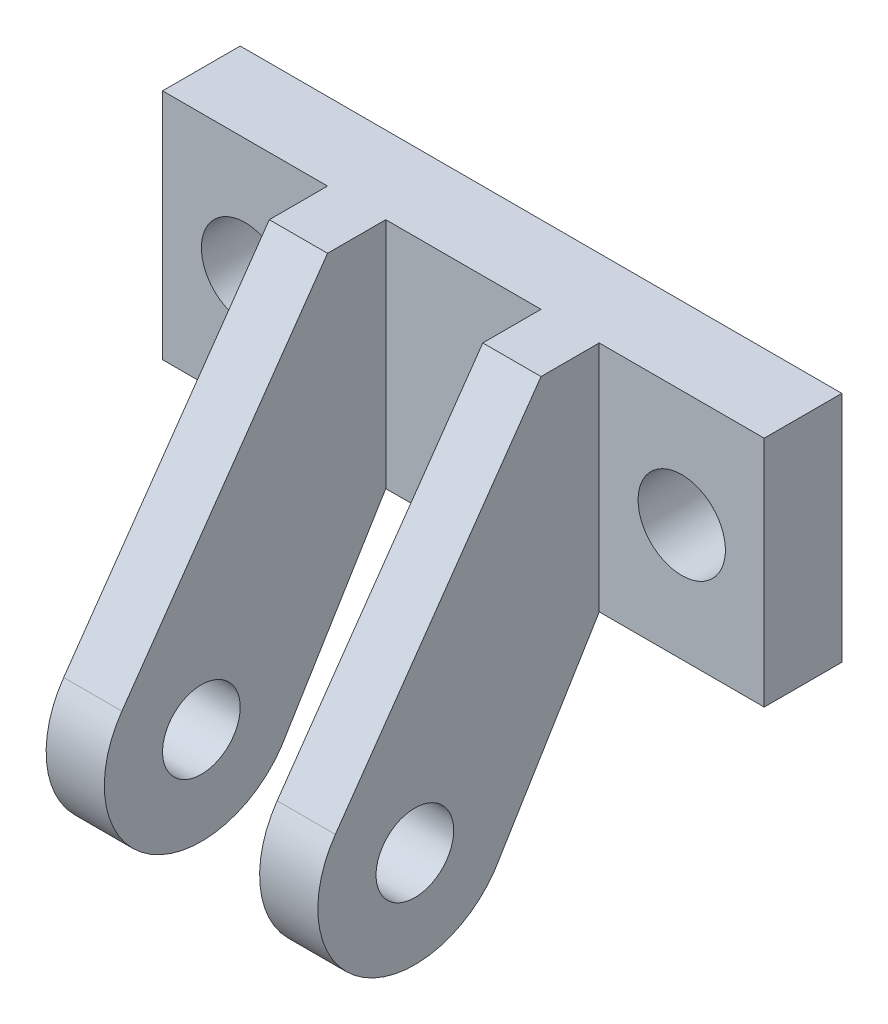
ISO-10303-21;
HEADER;
FILE_DESCRIPTION(('STEP AP214'),'2;1');
FILE_NAME('part.step','',(''),(''),'','','');
FILE_SCHEMA(('AUTOMOTIVE_DESIGN { 1 0 10303 214 1 1 1 1 }'));
ENDSEC;
DATA;
#1=APPLICATION_CONTEXT('core data for automotive mechanical design processes');
#2=APPLICATION_PROTOCOL_DEFINITION('international standard','automotive_design',2000,#1);
#3=PRODUCT_CONTEXT('',#1,'mechanical');
#4=PRODUCT('Part','Part','',(#3));
#5=PRODUCT_RELATED_PRODUCT_CATEGORY('part','',(#4));
#6=PRODUCT_DEFINITION_FORMATION('','',#4);
#7=PRODUCT_DEFINITION_CONTEXT('part definition',#1,'design');
#8=PRODUCT_DEFINITION('design','',#6,#7);
#9=PRODUCT_DEFINITION_SHAPE('','',#8);
#10=(LENGTH_UNIT() NAMED_UNIT(*) SI_UNIT(.MILLI.,.METRE.));
#11=(NAMED_UNIT(*) PLANE_ANGLE_UNIT() SI_UNIT($,.RADIAN.));
#12=(NAMED_UNIT(*) SI_UNIT($,.STERADIAN.) SOLID_ANGLE_UNIT());
#13=UNCERTAINTY_MEASURE_WITH_UNIT(LENGTH_MEASURE(1.E-05),#10,'distance_accuracy_value','');
#14=(GEOMETRIC_REPRESENTATION_CONTEXT(3) GLOBAL_UNCERTAINTY_ASSIGNED_CONTEXT((#13)) GLOBAL_UNIT_ASSIGNED_CONTEXT((#10,
#11,#12)) REPRESENTATION_CONTEXT('',''));
#15=CARTESIAN_POINT('',(0.,0.,0.));
#16=DIRECTION('',(0.,0.,1.));
#17=DIRECTION('',(1.,0.,0.));
#18=AXIS2_PLACEMENT_3D('',#15,#16,#17);
#19=CARTESIAN_POINT('',(31.,12.,8.));
#20=DIRECTION('',(0.,-1.,0.));
#21=DIRECTION('',(1.,0.,0.));
#22=AXIS2_PLACEMENT_3D('',#19,#20,#21);
#23=PLANE('',#22);
#24=DIRECTION('',(0.,0.,1.));
#25=VECTOR('',#24,1.);
#26=CARTESIAN_POINT('',(-8.,12.,8.));
#27=LINE('',#26,#25);
#28=CARTESIAN_POINT('',(-8.,12.,8.));
#29=VERTEX_POINT('',#28);
#30=CARTESIAN_POINT('',(-8.,12.,14.));
#31=VERTEX_POINT('',#30);
#32=EDGE_CURVE('E336',#29,#31,#27,.T.);
#33=ORIENTED_EDGE('',*,*,#32,.F.);
#34=DIRECTION('',(1.,0.,0.));
#35=VECTOR('',#34,1.);
#36=CARTESIAN_POINT('',(-8.,12.,8.));
#37=LINE('',#36,#35);
#38=CARTESIAN_POINT('',(8.,12.,8.));
#39=VERTEX_POINT('',#38);
#40=EDGE_CURVE('E297',#29,#39,#37,.T.);
#41=ORIENTED_EDGE('',*,*,#40,.T.);
#42=DIRECTION('',(0.,0.,1.));
#43=VECTOR('',#42,1.);
#44=CARTESIAN_POINT('',(8.,12.,8.));
#45=LINE('',#44,#43);
#46=CARTESIAN_POINT('',(8.,12.,14.));
#47=VERTEX_POINT('',#46);
#48=EDGE_CURVE('E319',#39,#47,#45,.T.);
#49=ORIENTED_EDGE('',*,*,#48,.T.);
#50=DIRECTION('',(-1.,0.,0.));
#51=VECTOR('',#50,1.);
#52=CARTESIAN_POINT('',(14.,12.,14.));
#53=LINE('',#52,#51);
#54=CARTESIAN_POINT('',(14.,12.,14.));
#55=VERTEX_POINT('',#54);
#56=EDGE_CURVE('E185',#55,#47,#53,.T.);
#57=ORIENTED_EDGE('',*,*,#56,.F.);
#58=DIRECTION('',(0.,0.,1.));
#59=VECTOR('',#58,1.);
#60=CARTESIAN_POINT('',(14.,12.,0.));
#61=LINE('',#60,#59);
#62=CARTESIAN_POINT('',(14.,12.,8.));
#63=VERTEX_POINT('',#62);
#64=EDGE_CURVE('E293',#63,#55,#61,.T.);
#65=ORIENTED_EDGE('',*,*,#64,.F.);
#66=DIRECTION('',(-1.,0.,0.));
#67=VECTOR('',#66,1.);
#68=CARTESIAN_POINT('',(31.,12.,8.));
#69=LINE('',#68,#67);
#70=CARTESIAN_POINT('',(31.,12.,8.));
#71=VERTEX_POINT('',#70);
#72=EDGE_CURVE('E226',#71,#63,#69,.T.);
#73=ORIENTED_EDGE('',*,*,#72,.F.);
#74=DIRECTION('',(0.,0.,-1.));
#75=VECTOR('',#74,1.);
#76=CARTESIAN_POINT('',(31.,12.,8.));
#77=LINE('',#76,#75);
#78=CARTESIAN_POINT('',(31.,12.,0.));
#79=VERTEX_POINT('',#78);
#80=EDGE_CURVE('E244',#71,#79,#77,.T.);
#81=ORIENTED_EDGE('',*,*,#80,.T.);
#82=DIRECTION('',(-1.,0.,0.));
#83=VECTOR('',#82,1.);
#84=CARTESIAN_POINT('',(31.,12.,0.));
#85=LINE('',#84,#83);
#86=CARTESIAN_POINT('',(-31.,12.,0.));
#87=VERTEX_POINT('',#86);
#88=EDGE_CURVE('E218',#79,#87,#85,.T.);
#89=ORIENTED_EDGE('',*,*,#88,.T.);
#90=DIRECTION('',(0.,0.,-1.));
#91=VECTOR('',#90,1.);
#92=CARTESIAN_POINT('',(-31.,12.,8.));
#93=LINE('',#92,#91);
#94=CARTESIAN_POINT('',(-31.,12.,8.));
#95=VERTEX_POINT('',#94);
#96=EDGE_CURVE('E229',#95,#87,#93,.T.);
#97=ORIENTED_EDGE('',*,*,#96,.F.);
#98=CARTESIAN_POINT('',(-14.,12.,8.));
#99=VERTEX_POINT('',#98);
#100=EDGE_CURVE('E225',#99,#95,#69,.T.);
#101=ORIENTED_EDGE('',*,*,#100,.F.);
#102=DIRECTION('',(0.,0.,1.));
#103=VECTOR('',#102,1.);
#104=CARTESIAN_POINT('',(-14.,12.,8.));
#105=LINE('',#104,#103);
#106=CARTESIAN_POINT('',(-14.,12.,14.));
#107=VERTEX_POINT('',#106);
#108=EDGE_CURVE('E286',#99,#107,#105,.T.);
#109=ORIENTED_EDGE('',*,*,#108,.T.);
#110=EDGE_CURVE('E184',#31,#107,#53,.T.);
#111=ORIENTED_EDGE('',*,*,#110,.F.);
#112=EDGE_LOOP('',(#33,#41,#49,#57,#65,#73,#81,#89,#97,#101,#109,#111));
#113=FACE_BOUND('',#112,.T.);
#114=ADVANCED_FACE('F39',(#113),#23,.F.);
#115=CARTESIAN_POINT('',(14.,12.,14.));
#116=DIRECTION('',(0.,-0.57358142201344,-0.819148553267989));
#117=DIRECTION('',(0.,0.819148553267989,-0.57358142201344));
#118=AXIS2_PLACEMENT_3D('',#115,#116,#117);
#119=PLANE('',#118);
#120=DIRECTION('',(0.,-0.819148553267989,0.57358142201344));
#121=VECTOR('',#120,1.);
#122=CARTESIAN_POINT('',(-8.,12.,14.));
#123=LINE('',#122,#121);
#124=CARTESIAN_POINT('',(-8.,-18.2641857798656,35.1914855326799));
#125=VERTEX_POINT('',#124);
#126=EDGE_CURVE('E149',#31,#125,#123,.T.);
#127=ORIENTED_EDGE('',*,*,#126,.F.);
#128=ORIENTED_EDGE('',*,*,#110,.T.);
#129=DIRECTION('',(0.,-0.819148553267989,0.57358142201344));
#130=VECTOR('',#129,1.);
#131=CARTESIAN_POINT('',(-14.,12.,14.));
#132=LINE('',#131,#130);
#133=CARTESIAN_POINT('',(-14.,-18.2641857798656,35.1914855326799));
#134=VERTEX_POINT('',#133);
#135=EDGE_CURVE('E281',#107,#134,#132,.T.);
#136=ORIENTED_EDGE('',*,*,#135,.T.);
#137=DIRECTION('',(-1.,0.,0.));
#138=VECTOR('',#137,1.);
#139=CARTESIAN_POINT('',(14.,-18.2641857798656,35.1914855326799));
#140=LINE('',#139,#138);
#141=EDGE_CURVE('E175',#125,#134,#140,.T.);
#142=ORIENTED_EDGE('',*,*,#141,.F.);
#143=EDGE_LOOP('',(#127,#128,#136,#142));
#144=FACE_BOUND('',#143,.T.);
#145=ADVANCED_FACE('F282',(#144),#119,.F.);
#146=CARTESIAN_POINT('',(14.,-24.,27.));
#147=DIRECTION('',(-1.,0.,0.));
#148=DIRECTION('',(0.,0.,1.));
#149=AXIS2_PLACEMENT_3D('',#146,#147,#148);
#150=CYLINDRICAL_SURFACE('',#149,10.);
#151=CARTESIAN_POINT('',(-8.,-24.,27.));
#152=DIRECTION('',(1.,0.,0.));
#153=DIRECTION('',(0.,0.,-1.));
#154=AXIS2_PLACEMENT_3D('',#151,#152,#153);
#155=CIRCLE('',#154,9.99999999999999);
#156=CARTESIAN_POINT('',(-8.,-29.7358142201343,18.8085144673201));
#157=VERTEX_POINT('',#156);
#158=EDGE_CURVE('E143',#125,#157,#155,.T.);
#159=ORIENTED_EDGE('',*,*,#158,.F.);
#160=ORIENTED_EDGE('',*,*,#141,.T.);
#161=CARTESIAN_POINT('',(-14.,-24.,27.));
#162=DIRECTION('',(1.,0.,0.));
#163=DIRECTION('',(0.,0.,-1.));
#164=AXIS2_PLACEMENT_3D('',#161,#162,#163);
#165=CIRCLE('',#164,10.);
#166=CARTESIAN_POINT('',(-14.,-29.7358142201343,18.8085144673201));
#167=VERTEX_POINT('',#166);
#168=EDGE_CURVE('E166',#134,#167,#165,.T.);
#169=ORIENTED_EDGE('',*,*,#168,.T.);
#170=DIRECTION('',(-1.,0.,0.));
#171=VECTOR('',#170,1.);
#172=CARTESIAN_POINT('',(14.,-29.7358142201343,18.8085144673201));
#173=LINE('',#172,#171);
#174=EDGE_CURVE('E159',#157,#167,#173,.T.);
#175=ORIENTED_EDGE('',*,*,#174,.F.);
#176=EDGE_LOOP('',(#159,#160,#169,#175));
#177=FACE_BOUND('',#176,.T.);
#178=ADVANCED_FACE('F164',(#177),#150,.T.);
#179=CARTESIAN_POINT('',(14.,-12.,8.));
#180=DIRECTION('',(0.,0.520396598495466,0.853924692390581));
#181=DIRECTION('',(0.,-0.853924692390581,0.520396598495466));
#182=AXIS2_PLACEMENT_3D('',#179,#180,#181);
#183=PLANE('',#182);
#184=DIRECTION('',(0.,0.853924692390581,-0.520396598495466));
#185=VECTOR('',#184,1.);
#186=CARTESIAN_POINT('',(-8.,-29.7358142201343,18.8085144673201));
#187=LINE('',#186,#185);
#188=CARTESIAN_POINT('',(-8.,-12.,8.));
#189=VERTEX_POINT('',#188);
#190=EDGE_CURVE('E147',#157,#189,#187,.T.);
#191=ORIENTED_EDGE('',*,*,#190,.F.);
#192=ORIENTED_EDGE('',*,*,#174,.T.);
#193=DIRECTION('',(0.,0.853924692390581,-0.520396598495466));
#194=VECTOR('',#193,1.);
#195=CARTESIAN_POINT('',(-14.,-12.,8.));
#196=LINE('',#195,#194);
#197=CARTESIAN_POINT('',(-14.,-12.,8.));
#198=VERTEX_POINT('',#197);
#199=EDGE_CURVE('E289',#167,#198,#196,.T.);
#200=ORIENTED_EDGE('',*,*,#199,.T.);
#201=DIRECTION('',(-1.,0.,0.));
#202=VECTOR('',#201,1.);
#203=CARTESIAN_POINT('',(14.,-12.,8.));
#204=LINE('',#203,#202);
#205=EDGE_CURVE('E64',#189,#198,#204,.T.);
#206=ORIENTED_EDGE('',*,*,#205,.F.);
#207=EDGE_LOOP('',(#191,#192,#200,#206));
#208=FACE_BOUND('',#207,.T.);
#209=ADVANCED_FACE('F157',(#208),#183,.F.);
#210=CARTESIAN_POINT('',(0.,0.,8.));
#211=DIRECTION('',(0.,0.,1.));
#212=DIRECTION('',(1.,0.,0.));
#213=AXIS2_PLACEMENT_3D('',#210,#211,#212);
#214=PLANE('',#213);
#215=CARTESIAN_POINT('',(-22.5,0.,8.));
#216=DIRECTION('',(0.,0.,1.));
#217=DIRECTION('',(1.,0.,0.));
#218=AXIS2_PLACEMENT_3D('',#215,#216,#217);
#219=CIRCLE('',#218,4.5);
#220=CARTESIAN_POINT('',(-18.,0.,8.));
#221=VERTEX_POINT('',#220);
#222=EDGE_CURVE('E205',#221,#221,#219,.T.);
#223=ORIENTED_EDGE('',*,*,#222,.F.);
#224=EDGE_LOOP('',(#223));
#225=FACE_BOUND('',#224,.T.);
#226=DIRECTION('',(1.,0.,0.));
#227=VECTOR('',#226,1.);
#228=CARTESIAN_POINT('',(31.,-12.,8.));
#229=LINE('',#228,#227);
#230=CARTESIAN_POINT('',(-31.,-12.,8.));
#231=VERTEX_POINT('',#230);
#232=EDGE_CURVE('E219',#231,#198,#229,.T.);
#233=ORIENTED_EDGE('',*,*,#232,.T.);
#234=DIRECTION('',(0.,1.,0.));
#235=VECTOR('',#234,1.);
#236=CARTESIAN_POINT('',(-14.,0.,8.));
#237=LINE('',#236,#235);
#238=EDGE_CURVE('E189',#198,#99,#237,.T.);
#239=ORIENTED_EDGE('',*,*,#238,.T.);
#240=ORIENTED_EDGE('',*,*,#100,.T.);
#241=DIRECTION('',(0.,-1.,0.));
#242=VECTOR('',#241,1.);
#243=CARTESIAN_POINT('',(-31.,-12.,8.));
#244=LINE('',#243,#242);
#245=EDGE_CURVE('E213',#95,#231,#244,.T.);
#246=ORIENTED_EDGE('',*,*,#245,.T.);
#247=EDGE_LOOP('',(#233,#239,#240,#246));
#248=FACE_BOUND('',#247,.T.);
#249=ADVANCED_FACE('F270',(#225,#248),#214,.T.);
#250=DIRECTION('',(0.,1.,0.));
#251=VECTOR('',#250,1.);
#252=CARTESIAN_POINT('',(14.,0.,8.));
#253=LINE('',#252,#251);
#254=CARTESIAN_POINT('',(14.,-12.,8.));
#255=VERTEX_POINT('',#254);
#256=EDGE_CURVE('E192',#255,#63,#253,.T.);
#257=ORIENTED_EDGE('',*,*,#256,.F.);
#258=CARTESIAN_POINT('',(31.,-12.,8.));
#259=VERTEX_POINT('',#258);
#260=EDGE_CURVE('E217',#255,#259,#229,.T.);
#261=ORIENTED_EDGE('',*,*,#260,.T.);
#262=DIRECTION('',(0.,1.,0.));
#263=VECTOR('',#262,1.);
#264=CARTESIAN_POINT('',(31.,-12.,8.));
#265=LINE('',#264,#263);
#266=EDGE_CURVE('E222',#259,#71,#265,.T.);
#267=ORIENTED_EDGE('',*,*,#266,.T.);
#268=ORIENTED_EDGE('',*,*,#72,.T.);
#269=EDGE_LOOP('',(#257,#261,#267,#268));
#270=FACE_BOUND('',#269,.T.);
#271=CARTESIAN_POINT('',(22.5,0.,8.));
#272=DIRECTION('',(0.,0.,1.));
#273=DIRECTION('',(-1.,0.,0.));
#274=AXIS2_PLACEMENT_3D('',#271,#272,#273);
#275=CIRCLE('',#274,4.5);
#276=CARTESIAN_POINT('',(18.,0.,8.));
#277=VERTEX_POINT('',#276);
#278=EDGE_CURVE('E197',#277,#277,#275,.T.);
#279=ORIENTED_EDGE('',*,*,#278,.F.);
#280=EDGE_LOOP('',(#279));
#281=FACE_BOUND('',#280,.T.);
#282=ADVANCED_FACE('F390',(#270,#281),#214,.T.);
#283=CARTESIAN_POINT('',(0.,0.,0.));
#284=DIRECTION('',(0.,0.,1.));
#285=DIRECTION('',(1.,0.,0.));
#286=AXIS2_PLACEMENT_3D('',#283,#284,#285);
#287=PLANE('',#286);
#288=DIRECTION('',(0.,1.,0.));
#289=VECTOR('',#288,1.);
#290=CARTESIAN_POINT('',(31.,-12.,0.));
#291=LINE('',#290,#289);
#292=CARTESIAN_POINT('',(31.,-12.,0.));
#293=VERTEX_POINT('',#292);
#294=EDGE_CURVE('E236',#293,#79,#291,.T.);
#295=ORIENTED_EDGE('',*,*,#294,.F.);
#296=DIRECTION('',(1.,0.,0.));
#297=VECTOR('',#296,1.);
#298=CARTESIAN_POINT('',(31.,-12.,0.));
#299=LINE('',#298,#297);
#300=CARTESIAN_POINT('',(-31.,-12.,0.));
#301=VERTEX_POINT('',#300);
#302=EDGE_CURVE('E233',#301,#293,#299,.T.);
#303=ORIENTED_EDGE('',*,*,#302,.F.);
#304=DIRECTION('',(0.,-1.,0.));
#305=VECTOR('',#304,1.);
#306=CARTESIAN_POINT('',(-31.,-12.,0.));
#307=LINE('',#306,#305);
#308=EDGE_CURVE('E209',#87,#301,#307,.T.);
#309=ORIENTED_EDGE('',*,*,#308,.F.);
#310=ORIENTED_EDGE('',*,*,#88,.F.);
#311=EDGE_LOOP('',(#295,#303,#309,#310));
#312=FACE_BOUND('',#311,.T.);
#313=CARTESIAN_POINT('',(22.5,0.,0.));
#314=DIRECTION('',(0.,0.,1.));
#315=DIRECTION('',(-1.,0.,0.));
#316=AXIS2_PLACEMENT_3D('',#313,#314,#315);
#317=CIRCLE('',#316,4.5);
#318=CARTESIAN_POINT('',(18.,0.,0.));
#319=VERTEX_POINT('',#318);
#320=EDGE_CURVE('E196',#319,#319,#317,.T.);
#321=ORIENTED_EDGE('',*,*,#320,.T.);
#322=EDGE_LOOP('',(#321));
#323=FACE_BOUND('',#322,.T.);
#324=CARTESIAN_POINT('',(-22.5,0.,0.));
#325=DIRECTION('',(0.,0.,1.));
#326=DIRECTION('',(1.,0.,0.));
#327=AXIS2_PLACEMENT_3D('',#324,#325,#326);
#328=CIRCLE('',#327,4.5);
#329=CARTESIAN_POINT('',(-18.,0.,0.));
#330=VERTEX_POINT('',#329);
#331=EDGE_CURVE('E201',#330,#330,#328,.T.);
#332=ORIENTED_EDGE('',*,*,#331,.T.);
#333=EDGE_LOOP('',(#332));
#334=FACE_BOUND('',#333,.T.);
#335=ADVANCED_FACE('F258',(#312,#323,#334),#287,.F.);
#336=CARTESIAN_POINT('',(-31.,-12.,8.));
#337=DIRECTION('',(1.,0.,0.));
#338=DIRECTION('',(0.,0.,-1.));
#339=AXIS2_PLACEMENT_3D('',#336,#337,#338);
#340=PLANE('',#339);
#341=ORIENTED_EDGE('',*,*,#308,.T.);
#342=DIRECTION('',(0.,0.,-1.));
#343=VECTOR('',#342,1.);
#344=CARTESIAN_POINT('',(-31.,-12.,8.));
#345=LINE('',#344,#343);
#346=EDGE_CURVE('E11',#231,#301,#345,.T.);
#347=ORIENTED_EDGE('',*,*,#346,.F.);
#348=ORIENTED_EDGE('',*,*,#245,.F.);
#349=ORIENTED_EDGE('',*,*,#96,.T.);
#350=EDGE_LOOP('',(#341,#347,#348,#349));
#351=FACE_BOUND('',#350,.T.);
#352=ADVANCED_FACE('F41',(#351),#340,.F.);
#353=CARTESIAN_POINT('',(31.,-12.,8.));
#354=DIRECTION('',(0.,1.,0.));
#355=DIRECTION('',(-1.,0.,0.));
#356=AXIS2_PLACEMENT_3D('',#353,#354,#355);
#357=PLANE('',#356);
#358=ORIENTED_EDGE('',*,*,#260,.F.);
#359=CARTESIAN_POINT('',(8.,-12.,8.));
#360=VERTEX_POINT('',#359);
#361=EDGE_CURVE('E170',#255,#360,#204,.T.);
#362=ORIENTED_EDGE('',*,*,#361,.T.);
#363=DIRECTION('',(1.,0.,0.));
#364=VECTOR('',#363,1.);
#365=CARTESIAN_POINT('',(-8.,-12.,8.));
#366=LINE('',#365,#364);
#367=EDGE_CURVE('E310',#189,#360,#366,.T.);
#368=ORIENTED_EDGE('',*,*,#367,.F.);
#369=ORIENTED_EDGE('',*,*,#205,.T.);
#370=ORIENTED_EDGE('',*,*,#232,.F.);
#371=ORIENTED_EDGE('',*,*,#346,.T.);
#372=ORIENTED_EDGE('',*,*,#302,.T.);
#373=DIRECTION('',(0.,0.,-1.));
#374=VECTOR('',#373,1.);
#375=CARTESIAN_POINT('',(31.,-12.,8.));
#376=LINE('',#375,#374);
#377=EDGE_CURVE('E49',#259,#293,#376,.T.);
#378=ORIENTED_EDGE('',*,*,#377,.F.);
#379=EDGE_LOOP('',(#358,#362,#368,#369,#370,#371,#372,#378));
#380=FACE_BOUND('',#379,.T.);
#381=ADVANCED_FACE('F382',(#380),#357,.F.);
#382=CARTESIAN_POINT('',(31.,-12.,8.));
#383=DIRECTION('',(-1.,0.,0.));
#384=DIRECTION('',(0.,0.,1.));
#385=AXIS2_PLACEMENT_3D('',#382,#383,#384);
#386=PLANE('',#385);
#387=ORIENTED_EDGE('',*,*,#294,.T.);
#388=ORIENTED_EDGE('',*,*,#80,.F.);
#389=ORIENTED_EDGE('',*,*,#266,.F.);
#390=ORIENTED_EDGE('',*,*,#377,.T.);
#391=EDGE_LOOP('',(#387,#388,#389,#390));
#392=FACE_BOUND('',#391,.T.);
#393=ADVANCED_FACE('F254',(#392),#386,.F.);
#394=CARTESIAN_POINT('',(-22.5,0.,8.));
#395=DIRECTION('',(0.,0.,-1.));
#396=DIRECTION('',(-1.,0.,0.));
#397=AXIS2_PLACEMENT_3D('',#394,#395,#396);
#398=CYLINDRICAL_SURFACE('',#397,4.5);
#399=ORIENTED_EDGE('',*,*,#222,.T.);
#400=EDGE_LOOP('',(#399));
#401=FACE_BOUND('',#400,.T.);
#402=ORIENTED_EDGE('',*,*,#331,.F.);
#403=EDGE_LOOP('',(#402));
#404=FACE_BOUND('',#403,.T.);
#405=ADVANCED_FACE('F381',(#401,#404),#398,.F.);
#406=CARTESIAN_POINT('',(22.5,0.,8.));
#407=DIRECTION('',(0.,0.,-1.));
#408=DIRECTION('',(-1.,0.,0.));
#409=AXIS2_PLACEMENT_3D('',#406,#407,#408);
#410=CYLINDRICAL_SURFACE('',#409,4.5);
#411=ORIENTED_EDGE('',*,*,#278,.T.);
#412=EDGE_LOOP('',(#411));
#413=FACE_BOUND('',#412,.T.);
#414=ORIENTED_EDGE('',*,*,#320,.F.);
#415=EDGE_LOOP('',(#414));
#416=FACE_BOUND('',#415,.T.);
#417=ADVANCED_FACE('F426',(#413,#416),#410,.F.);
#418=ORIENTED_EDGE('',*,*,#56,.T.);
#419=DIRECTION('',(0.,-0.819148553267989,0.57358142201344));
#420=VECTOR('',#419,1.);
#421=CARTESIAN_POINT('',(8.,12.,14.));
#422=LINE('',#421,#420);
#423=CARTESIAN_POINT('',(8.,-18.2641857798656,35.1914855326799));
#424=VERTEX_POINT('',#423);
#425=EDGE_CURVE('E154',#47,#424,#422,.T.);
#426=ORIENTED_EDGE('',*,*,#425,.T.);
#427=CARTESIAN_POINT('',(14.,-18.2641857798656,35.1914855326799));
#428=VERTEX_POINT('',#427);
#429=EDGE_CURVE('E180',#428,#424,#140,.T.);
#430=ORIENTED_EDGE('',*,*,#429,.F.);
#431=DIRECTION('',(0.,-0.819148553267989,0.57358142201344));
#432=VECTOR('',#431,1.);
#433=CARTESIAN_POINT('',(14.,12.,14.));
#434=LINE('',#433,#432);
#435=EDGE_CURVE('E305',#55,#428,#434,.T.);
#436=ORIENTED_EDGE('',*,*,#435,.F.);
#437=EDGE_LOOP('',(#418,#426,#430,#436));
#438=FACE_BOUND('',#437,.T.);
#439=ADVANCED_FACE('F376',(#438),#119,.F.);
#440=ORIENTED_EDGE('',*,*,#429,.T.);
#441=CARTESIAN_POINT('',(8.,-24.,27.));
#442=DIRECTION('',(1.,0.,0.));
#443=DIRECTION('',(0.,0.,-1.));
#444=AXIS2_PLACEMENT_3D('',#441,#442,#443);
#445=CIRCLE('',#444,9.99999999999999);
#446=CARTESIAN_POINT('',(8.,-29.7358142201343,18.8085144673201));
#447=VERTEX_POINT('',#446);
#448=EDGE_CURVE('E329',#424,#447,#445,.T.);
#449=ORIENTED_EDGE('',*,*,#448,.T.);
#450=CARTESIAN_POINT('',(14.,-29.7358142201343,18.8085144673201));
#451=VERTEX_POINT('',#450);
#452=EDGE_CURVE('E169',#451,#447,#173,.T.);
#453=ORIENTED_EDGE('',*,*,#452,.F.);
#454=CARTESIAN_POINT('',(14.,-24.,27.));
#455=DIRECTION('',(1.,0.,0.));
#456=DIRECTION('',(0.,0.,-1.));
#457=AXIS2_PLACEMENT_3D('',#454,#455,#456);
#458=CIRCLE('',#457,10.);
#459=EDGE_CURVE('E302',#428,#451,#458,.T.);
#460=ORIENTED_EDGE('',*,*,#459,.F.);
#461=EDGE_LOOP('',(#440,#449,#453,#460));
#462=FACE_BOUND('',#461,.T.);
#463=ADVANCED_FACE('F401',(#462),#150,.T.);
#464=ORIENTED_EDGE('',*,*,#452,.T.);
#465=DIRECTION('',(0.,0.853924692390581,-0.520396598495466));
#466=VECTOR('',#465,1.);
#467=CARTESIAN_POINT('',(8.,-29.7358142201343,18.8085144673201));
#468=LINE('',#467,#466);
#469=EDGE_CURVE('E325',#447,#360,#468,.T.);
#470=ORIENTED_EDGE('',*,*,#469,.T.);
#471=ORIENTED_EDGE('',*,*,#361,.F.);
#472=DIRECTION('',(0.,0.853924692390581,-0.520396598495466));
#473=VECTOR('',#472,1.);
#474=CARTESIAN_POINT('',(14.,-12.,8.));
#475=LINE('',#474,#473);
#476=EDGE_CURVE('E298',#451,#255,#475,.T.);
#477=ORIENTED_EDGE('',*,*,#476,.F.);
#478=EDGE_LOOP('',(#464,#470,#471,#477));
#479=FACE_BOUND('',#478,.T.);
#480=ADVANCED_FACE('F399',(#479),#183,.F.);
#481=CARTESIAN_POINT('',(14.,-24.,27.));
#482=DIRECTION('',(1.,0.,0.));
#483=DIRECTION('',(0.,0.,-1.));
#484=AXIS2_PLACEMENT_3D('',#481,#482,#483);
#485=PLANE('',#484);
#486=CARTESIAN_POINT('',(14.,-24.,27.));
#487=DIRECTION('',(1.,0.,0.));
#488=DIRECTION('',(0.,0.,-1.));
#489=AXIS2_PLACEMENT_3D('',#486,#487,#488);
#490=CIRCLE('',#489,4.);
#491=CARTESIAN_POINT('',(14.,-24.,23.));
#492=VERTEX_POINT('',#491);
#493=EDGE_CURVE('E333',#492,#492,#490,.T.);
#494=ORIENTED_EDGE('',*,*,#493,.F.);
#495=EDGE_LOOP('',(#494));
#496=FACE_BOUND('',#495,.T.);
#497=ORIENTED_EDGE('',*,*,#476,.T.);
#498=ORIENTED_EDGE('',*,*,#256,.T.);
#499=ORIENTED_EDGE('',*,*,#64,.T.);
#500=ORIENTED_EDGE('',*,*,#435,.T.);
#501=ORIENTED_EDGE('',*,*,#459,.T.);
#502=EDGE_LOOP('',(#497,#498,#499,#500,#501));
#503=FACE_BOUND('',#502,.T.);
#504=ADVANCED_FACE('F395',(#496,#503),#485,.T.);
#505=CARTESIAN_POINT('',(-14.,-24.,27.));
#506=DIRECTION('',(1.,0.,0.));
#507=DIRECTION('',(0.,0.,-1.));
#508=AXIS2_PLACEMENT_3D('',#505,#506,#507);
#509=PLANE('',#508);
#510=CARTESIAN_POINT('',(-14.,-24.,27.));
#511=DIRECTION('',(1.,0.,0.));
#512=DIRECTION('',(0.,0.,-1.));
#513=AXIS2_PLACEMENT_3D('',#510,#511,#512);
#514=CIRCLE('',#513,4.);
#515=CARTESIAN_POINT('',(-14.,-24.,23.));
#516=VERTEX_POINT('',#515);
#517=EDGE_CURVE('E344',#516,#516,#514,.T.);
#518=ORIENTED_EDGE('',*,*,#517,.T.);
#519=EDGE_LOOP('',(#518));
#520=FACE_BOUND('',#519,.T.);
#521=ORIENTED_EDGE('',*,*,#238,.F.);
#522=ORIENTED_EDGE('',*,*,#199,.F.);
#523=ORIENTED_EDGE('',*,*,#168,.F.);
#524=ORIENTED_EDGE('',*,*,#135,.F.);
#525=ORIENTED_EDGE('',*,*,#108,.F.);
#526=EDGE_LOOP('',(#521,#522,#523,#524,#525));
#527=FACE_BOUND('',#526,.T.);
#528=ADVANCED_FACE('F288',(#520,#527),#509,.F.);
#529=CARTESIAN_POINT('',(-8.,-12.,8.));
#530=DIRECTION('',(0.,0.,-1.));
#531=DIRECTION('',(-1.,0.,0.));
#532=AXIS2_PLACEMENT_3D('',#529,#530,#531);
#533=PLANE('',#532);
#534=DIRECTION('',(0.,1.,0.));
#535=VECTOR('',#534,1.);
#536=CARTESIAN_POINT('',(8.,-12.,8.));
#537=LINE('',#536,#535);
#538=EDGE_CURVE('E56',#360,#39,#537,.T.);
#539=ORIENTED_EDGE('',*,*,#538,.T.);
#540=ORIENTED_EDGE('',*,*,#40,.F.);
#541=DIRECTION('',(0.,1.,0.));
#542=VECTOR('',#541,1.);
#543=CARTESIAN_POINT('',(-8.,-12.,8.));
#544=LINE('',#543,#542);
#545=EDGE_CURVE('E162',#189,#29,#544,.T.);
#546=ORIENTED_EDGE('',*,*,#545,.F.);
#547=ORIENTED_EDGE('',*,*,#367,.T.);
#548=EDGE_LOOP('',(#539,#540,#546,#547));
#549=FACE_BOUND('',#548,.T.);
#550=ADVANCED_FACE('F407',(#549),#533,.F.);
#551=CARTESIAN_POINT('',(-8.,-24.,27.));
#552=DIRECTION('',(1.,0.,0.));
#553=DIRECTION('',(0.,0.,-1.));
#554=AXIS2_PLACEMENT_3D('',#551,#552,#553);
#555=PLANE('',#554);
#556=CARTESIAN_POINT('',(-8.,-24.,27.));
#557=DIRECTION('',(1.,0.,0.));
#558=DIRECTION('',(0.,0.,-1.));
#559=AXIS2_PLACEMENT_3D('',#556,#557,#558);
#560=CIRCLE('',#559,4.);
#561=CARTESIAN_POINT('',(-8.,-24.,23.));
#562=VERTEX_POINT('',#561);
#563=EDGE_CURVE('E348',#562,#562,#560,.T.);
#564=ORIENTED_EDGE('',*,*,#563,.F.);
#565=EDGE_LOOP('',(#564));
#566=FACE_BOUND('',#565,.T.);
#567=ORIENTED_EDGE('',*,*,#158,.T.);
#568=ORIENTED_EDGE('',*,*,#190,.T.);
#569=ORIENTED_EDGE('',*,*,#545,.T.);
#570=ORIENTED_EDGE('',*,*,#32,.T.);
#571=ORIENTED_EDGE('',*,*,#126,.T.);
#572=EDGE_LOOP('',(#567,#568,#569,#570,#571));
#573=FACE_BOUND('',#572,.T.);
#574=ADVANCED_FACE('F145',(#566,#573),#555,.T.);
#575=CARTESIAN_POINT('',(8.,-24.,27.));
#576=DIRECTION('',(1.,0.,0.));
#577=DIRECTION('',(0.,0.,-1.));
#578=AXIS2_PLACEMENT_3D('',#575,#576,#577);
#579=PLANE('',#578);
#580=CARTESIAN_POINT('',(8.,-24.,27.));
#581=DIRECTION('',(1.,0.,0.));
#582=DIRECTION('',(0.,0.,-1.));
#583=AXIS2_PLACEMENT_3D('',#580,#581,#582);
#584=CIRCLE('',#583,4.);
#585=CARTESIAN_POINT('',(8.,-24.,23.));
#586=VERTEX_POINT('',#585);
#587=EDGE_CURVE('E43',#586,#586,#584,.T.);
#588=ORIENTED_EDGE('',*,*,#587,.T.);
#589=EDGE_LOOP('',(#588));
#590=FACE_BOUND('',#589,.T.);
#591=ORIENTED_EDGE('',*,*,#448,.F.);
#592=ORIENTED_EDGE('',*,*,#425,.F.);
#593=ORIENTED_EDGE('',*,*,#48,.F.);
#594=ORIENTED_EDGE('',*,*,#538,.F.);
#595=ORIENTED_EDGE('',*,*,#469,.F.);
#596=EDGE_LOOP('',(#591,#592,#593,#594,#595));
#597=FACE_BOUND('',#596,.T.);
#598=ADVANCED_FACE('F357',(#590,#597),#579,.F.);
#599=CARTESIAN_POINT('',(-31.,-24.,27.));
#600=DIRECTION('',(1.,0.,0.));
#601=DIRECTION('',(0.,0.,-1.));
#602=AXIS2_PLACEMENT_3D('',#599,#600,#601);
#603=CYLINDRICAL_SURFACE('',#602,4.);
#604=CARTESIAN_POINT('',(14.,-24.,23.));
#605=CARTESIAN_POINT('',(13.9375,-24.,23.));
#606=CARTESIAN_POINT('',(13.875,-24.,23.));
#607=CARTESIAN_POINT('',(13.75,-24.,23.));
#608=CARTESIAN_POINT('',(13.6875,-24.,23.));
#609=CARTESIAN_POINT('',(13.5625,-24.,23.));
#610=CARTESIAN_POINT('',(13.5,-24.,23.));
#611=CARTESIAN_POINT('',(13.375,-24.,23.));
#612=CARTESIAN_POINT('',(13.3125,-24.,23.));
#613=CARTESIAN_POINT('',(13.1875,-24.,23.));
#614=CARTESIAN_POINT('',(13.125,-24.,23.));
#615=CARTESIAN_POINT('',(13.,-24.,23.));
#616=CARTESIAN_POINT('',(12.9375,-24.,23.));
#617=CARTESIAN_POINT('',(12.8125,-24.,23.));
#618=CARTESIAN_POINT('',(12.75,-24.,23.));
#619=CARTESIAN_POINT('',(12.625,-24.,23.));
#620=CARTESIAN_POINT('',(12.5625,-24.,23.));
#621=CARTESIAN_POINT('',(12.4375,-24.,23.));
#622=CARTESIAN_POINT('',(12.375,-24.,23.));
#623=CARTESIAN_POINT('',(12.25,-24.,23.));
#624=CARTESIAN_POINT('',(12.1875,-24.,23.));
#625=CARTESIAN_POINT('',(12.0625,-24.,23.));
#626=CARTESIAN_POINT('',(12.,-24.,23.));
#627=CARTESIAN_POINT('',(11.875,-24.,23.));
#628=CARTESIAN_POINT('',(11.8125,-24.,23.));
#629=CARTESIAN_POINT('',(11.6875,-24.,23.));
#630=CARTESIAN_POINT('',(11.625,-24.,23.));
#631=CARTESIAN_POINT('',(11.5,-24.,23.));
#632=CARTESIAN_POINT('',(11.4375,-24.,23.));
#633=CARTESIAN_POINT('',(11.3125,-24.,23.));
#634=CARTESIAN_POINT('',(11.25,-24.,23.));
#635=CARTESIAN_POINT('',(11.125,-24.,23.));
#636=CARTESIAN_POINT('',(11.0625,-24.,23.));
#637=CARTESIAN_POINT('',(10.9375,-24.,23.));
#638=CARTESIAN_POINT('',(10.875,-24.,23.));
#639=CARTESIAN_POINT('',(10.75,-24.,23.));
#640=CARTESIAN_POINT('',(10.6875,-24.,23.));
#641=CARTESIAN_POINT('',(10.5625,-24.,23.));
#642=CARTESIAN_POINT('',(10.5,-24.,23.));
#643=CARTESIAN_POINT('',(10.375,-24.,23.));
#644=CARTESIAN_POINT('',(10.3125,-24.,23.));
#645=CARTESIAN_POINT('',(10.1875,-24.,23.));
#646=CARTESIAN_POINT('',(10.125,-24.,23.));
#647=CARTESIAN_POINT('',(9.99999999999999,-24.,23.));
#648=CARTESIAN_POINT('',(9.93749999999999,-24.,23.));
#649=CARTESIAN_POINT('',(9.81249999999999,-24.,23.));
#650=CARTESIAN_POINT('',(9.74999999999999,-24.,23.));
#651=CARTESIAN_POINT('',(9.625,-24.,23.));
#652=CARTESIAN_POINT('',(9.5625,-24.,23.));
#653=CARTESIAN_POINT('',(9.4375,-24.,23.));
#654=CARTESIAN_POINT('',(9.375,-24.,23.));
#655=CARTESIAN_POINT('',(9.25,-24.,23.));
#656=CARTESIAN_POINT('',(9.1875,-24.,23.));
#657=CARTESIAN_POINT('',(9.0625,-24.,23.));
#658=CARTESIAN_POINT('',(9.,-24.,23.));
#659=CARTESIAN_POINT('',(8.875,-24.,23.));
#660=CARTESIAN_POINT('',(8.8125,-24.,23.));
#661=CARTESIAN_POINT('',(8.6875,-24.,23.));
#662=CARTESIAN_POINT('',(8.625,-24.,23.));
#663=CARTESIAN_POINT('',(8.5,-24.,23.));
#664=CARTESIAN_POINT('',(8.4375,-24.,23.));
#665=CARTESIAN_POINT('',(8.3125,-24.,23.));
#666=CARTESIAN_POINT('',(8.25,-24.,23.));
#667=CARTESIAN_POINT('',(8.125,-24.,23.));
#668=CARTESIAN_POINT('',(8.0625,-24.,23.));
#669=CARTESIAN_POINT('',(8.,-24.,23.));
#670=B_SPLINE_CURVE_WITH_KNOTS('',3,(#604,#605,#606,#607,#608,#609,#610,#611,#612,#613,#614,
#615,#616,#617,#618,#619,#620,#621,#622,#623,#624,#625,#626,#627,#628,#629,#630,#631,#632,#633,
#634,#635,#636,#637,#638,#639,#640,#641,#642,#643,#644,#645,#646,#647,#648,#649,#650,#651,#652,
#653,#654,#655,#656,#657,#658,#659,#660,#661,#662,#663,#664,#665,#666,#667,#668,#669),
.UNSPECIFIED.,.F.,.F.,(4,2,2,2,2,2,2,2,2,2,2,2,2,2,2,2,2,2,2,2,2,2,2,2,2,2,2,2,2,2,2,2,4),(0.,
0.1875,0.375,0.5625,0.750000000000001,0.937500000000001,1.125,1.3125,1.5,1.68749999999999,
1.87499999999999,2.06249999999999,2.25,2.4375,2.625,2.8125,3.,3.1875,3.375,3.5625,3.75,3.9375,
4.125,4.3125,4.49999999999999,4.6875,4.87499999999999,5.06249999999999,5.24999999999999,
5.43749999999999,5.62499999999999,5.81249999999999,5.99999999999999),.UNSPECIFIED.);
#671=EDGE_CURVE('BSEAM359',#492,#586,#670,.T.);
#672=ORIENTED_EDGE('',*,*,#493,.T.);
#673=ORIENTED_EDGE('',*,*,#587,.F.);
#674=ORIENTED_EDGE('',*,*,#671,.T.);
#675=ORIENTED_EDGE('',*,*,#671,.F.);
#676=EDGE_LOOP('',(#672,#674,#673,#675));
#677=FACE_BOUND('',#676,.T.);
#678=ADVANCED_FACE('F359',(#677),#603,.F.);
#679=CARTESIAN_POINT('',(-8.,-24.,23.));
#680=CARTESIAN_POINT('',(-8.0625,-24.,23.));
#681=CARTESIAN_POINT('',(-8.125,-24.,23.));
#682=CARTESIAN_POINT('',(-8.25,-24.,23.));
#683=CARTESIAN_POINT('',(-8.3125,-24.,23.));
#684=CARTESIAN_POINT('',(-8.4375,-24.,23.));
#685=CARTESIAN_POINT('',(-8.5,-24.,23.));
#686=CARTESIAN_POINT('',(-8.625,-24.,23.));
#687=CARTESIAN_POINT('',(-8.6875,-24.,23.));
#688=CARTESIAN_POINT('',(-8.8125,-24.,23.));
#689=CARTESIAN_POINT('',(-8.875,-24.,23.));
#690=CARTESIAN_POINT('',(-9.00000000000001,-24.,23.));
#691=CARTESIAN_POINT('',(-9.06250000000001,-24.,23.));
#692=CARTESIAN_POINT('',(-9.18750000000001,-24.,23.));
#693=CARTESIAN_POINT('',(-9.25000000000001,-24.,23.));
#694=CARTESIAN_POINT('',(-9.37500000000001,-24.,23.));
#695=CARTESIAN_POINT('',(-9.43750000000001,-24.,23.));
#696=CARTESIAN_POINT('',(-9.5625,-24.,23.));
#697=CARTESIAN_POINT('',(-9.625,-24.,23.));
#698=CARTESIAN_POINT('',(-9.75,-24.,23.));
#699=CARTESIAN_POINT('',(-9.8125,-24.,23.));
#700=CARTESIAN_POINT('',(-9.9375,-24.,23.));
#701=CARTESIAN_POINT('',(-10.,-24.,23.));
#702=CARTESIAN_POINT('',(-10.125,-24.,23.));
#703=CARTESIAN_POINT('',(-10.1875,-24.,23.));
#704=CARTESIAN_POINT('',(-10.3125,-24.,23.));
#705=CARTESIAN_POINT('',(-10.375,-24.,23.));
#706=CARTESIAN_POINT('',(-10.5,-24.,23.));
#707=CARTESIAN_POINT('',(-10.5625,-24.,23.));
#708=CARTESIAN_POINT('',(-10.6875,-24.,23.));
#709=CARTESIAN_POINT('',(-10.75,-24.,23.));
#710=CARTESIAN_POINT('',(-10.875,-24.,23.));
#711=CARTESIAN_POINT('',(-10.9375,-24.,23.));
#712=CARTESIAN_POINT('',(-11.0625,-24.,23.));
#713=CARTESIAN_POINT('',(-11.125,-24.,23.));
#714=CARTESIAN_POINT('',(-11.25,-24.,23.));
#715=CARTESIAN_POINT('',(-11.3125,-24.,23.));
#716=CARTESIAN_POINT('',(-11.4375,-24.,23.));
#717=CARTESIAN_POINT('',(-11.5,-24.,23.));
#718=CARTESIAN_POINT('',(-11.625,-24.,23.));
#719=CARTESIAN_POINT('',(-11.6875,-24.,23.));
#720=CARTESIAN_POINT('',(-11.8125,-24.,23.));
#721=CARTESIAN_POINT('',(-11.875,-24.,23.));
#722=CARTESIAN_POINT('',(-12.,-24.,23.));
#723=CARTESIAN_POINT('',(-12.0625,-24.,23.));
#724=CARTESIAN_POINT('',(-12.1875,-24.,23.));
#725=CARTESIAN_POINT('',(-12.25,-24.,23.));
#726=CARTESIAN_POINT('',(-12.375,-24.,23.));
#727=CARTESIAN_POINT('',(-12.4375,-24.,23.));
#728=CARTESIAN_POINT('',(-12.5625,-24.,23.));
#729=CARTESIAN_POINT('',(-12.625,-24.,23.));
#730=CARTESIAN_POINT('',(-12.75,-24.,23.));
#731=CARTESIAN_POINT('',(-12.8125,-24.,23.));
#732=CARTESIAN_POINT('',(-12.9375,-24.,23.));
#733=CARTESIAN_POINT('',(-13.,-24.,23.));
#734=CARTESIAN_POINT('',(-13.125,-24.,23.));
#735=CARTESIAN_POINT('',(-13.1875,-24.,23.));
#736=CARTESIAN_POINT('',(-13.3125,-24.,23.));
#737=CARTESIAN_POINT('',(-13.375,-24.,23.));
#738=CARTESIAN_POINT('',(-13.5,-24.,23.));
#739=CARTESIAN_POINT('',(-13.5625,-24.,23.));
#740=CARTESIAN_POINT('',(-13.6875,-24.,23.));
#741=CARTESIAN_POINT('',(-13.75,-24.,23.));
#742=CARTESIAN_POINT('',(-13.875,-24.,23.));
#743=CARTESIAN_POINT('',(-13.9375,-24.,23.));
#744=CARTESIAN_POINT('',(-14.,-24.,23.));
#745=B_SPLINE_CURVE_WITH_KNOTS('',3,(#679,#680,#681,#682,#683,#684,#685,#686,#687,#688,#689,
#690,#691,#692,#693,#694,#695,#696,#697,#698,#699,#700,#701,#702,#703,#704,#705,#706,#707,#708,
#709,#710,#711,#712,#713,#714,#715,#716,#717,#718,#719,#720,#721,#722,#723,#724,#725,#726,#727,
#728,#729,#730,#731,#732,#733,#734,#735,#736,#737,#738,#739,#740,#741,#742,#743,#744),
.UNSPECIFIED.,.F.,.F.,(4,2,2,2,2,2,2,2,2,2,2,2,2,2,2,2,2,2,2,2,2,2,2,2,2,2,2,2,2,2,2,2,4),(0.,
0.1875,0.375,0.5625,0.750000000000001,0.937500000000001,1.125,1.3125,1.5,1.6875,1.875,2.0625,
2.25,2.4375,2.625,2.8125,3.,3.1875,3.375,3.5625,3.75,3.9375,4.125,4.3125,4.5,4.6875,4.875,
5.0625,5.25,5.4375,5.625,5.8125,6.),.UNSPECIFIED.);
#746=EDGE_CURVE('BSEAM361',#562,#516,#745,.T.);
#747=ORIENTED_EDGE('',*,*,#563,.T.);
#748=ORIENTED_EDGE('',*,*,#517,.F.);
#749=ORIENTED_EDGE('',*,*,#746,.T.);
#750=ORIENTED_EDGE('',*,*,#746,.F.);
#751=EDGE_LOOP('',(#747,#749,#748,#750));
#752=FACE_BOUND('',#751,.T.);
#753=ADVANCED_FACE('F361',(#752),#603,.F.);
#754=CLOSED_SHELL('',(#114,#145,#178,#209,#249,#282,#335,#352,#381,#393,#405,#417,#439,#463,
#480,#504,#528,#550,#574,#598,#678,#753));
#755=MANIFOLD_SOLID_BREP('B2',#754);
#756=ADVANCED_BREP_SHAPE_REPRESENTATION('',(#18,#755),#14);
#757=SHAPE_DEFINITION_REPRESENTATION(#9,#756);
ENDSEC;
END-ISO-10303-21;
